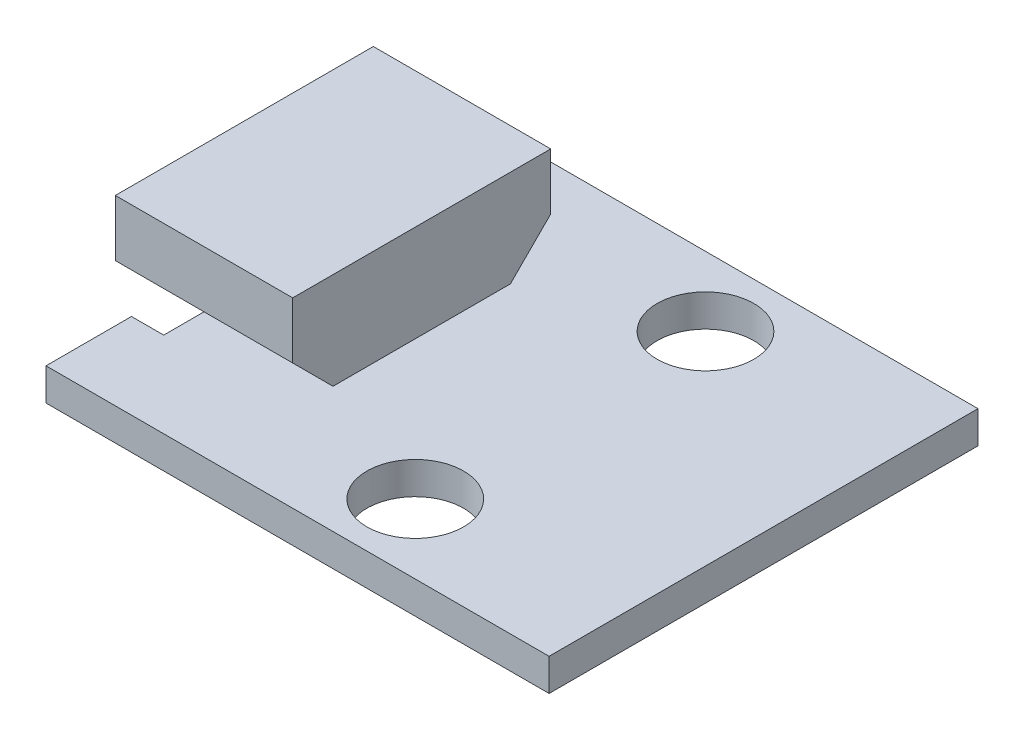
ISO-10303-21;
HEADER;
FILE_DESCRIPTION(('STEP AP214'),'2;1');
FILE_NAME('part.step','',(''),(''),'','','');
FILE_SCHEMA(('AUTOMOTIVE_DESIGN { 1 0 10303 214 1 1 1 1 }'));
ENDSEC;
DATA;
#1=APPLICATION_CONTEXT('core data for automotive mechanical design processes');
#2=APPLICATION_PROTOCOL_DEFINITION('international standard','automotive_design',2000,#1);
#3=PRODUCT_CONTEXT('',#1,'mechanical');
#4=PRODUCT('Part','Part','',(#3));
#5=PRODUCT_RELATED_PRODUCT_CATEGORY('part','',(#4));
#6=PRODUCT_DEFINITION_FORMATION('','',#4);
#7=PRODUCT_DEFINITION_CONTEXT('part definition',#1,'design');
#8=PRODUCT_DEFINITION('design','',#6,#7);
#9=PRODUCT_DEFINITION_SHAPE('','',#8);
#10=(LENGTH_UNIT() NAMED_UNIT(*) SI_UNIT(.MILLI.,.METRE.));
#11=(NAMED_UNIT(*) PLANE_ANGLE_UNIT() SI_UNIT($,.RADIAN.));
#12=(NAMED_UNIT(*) SI_UNIT($,.STERADIAN.) SOLID_ANGLE_UNIT());
#13=UNCERTAINTY_MEASURE_WITH_UNIT(LENGTH_MEASURE(1.E-05),#10,'distance_accuracy_value','');
#14=(GEOMETRIC_REPRESENTATION_CONTEXT(3) GLOBAL_UNCERTAINTY_ASSIGNED_CONTEXT((#13)) GLOBAL_UNIT_ASSIGNED_CONTEXT((#10,
#11,#12)) REPRESENTATION_CONTEXT('',''));
#15=CARTESIAN_POINT('',(0.,0.,0.));
#16=DIRECTION('',(0.,0.,1.));
#17=DIRECTION('',(1.,0.,0.));
#18=AXIS2_PLACEMENT_3D('',#15,#16,#17);
#19=CARTESIAN_POINT('',(-10.6,2.25,-10.65));
#20=DIRECTION('',(0.,0.,-1.));
#21=DIRECTION('',(-1.,0.,0.));
#22=AXIS2_PLACEMENT_3D('',#19,#20,#21);
#23=PLANE('',#22);
#24=DIRECTION('',(0.,-1.,0.));
#25=VECTOR('',#24,1.);
#26=CARTESIAN_POINT('',(-16.1,2.25,-10.65));
#27=LINE('',#26,#25);
#28=CARTESIAN_POINT('',(-16.1,4.,-10.65));
#29=VERTEX_POINT('',#28);
#30=CARTESIAN_POINT('',(-16.1,2.25,-10.65));
#31=VERTEX_POINT('',#30);
#32=EDGE_CURVE('E144',#29,#31,#27,.T.);
#33=ORIENTED_EDGE('',*,*,#32,.F.);
#34=DIRECTION('',(-1.,0.,0.));
#35=VECTOR('',#34,1.);
#36=CARTESIAN_POINT('',(-10.6,4.,-10.65));
#37=LINE('',#36,#35);
#38=CARTESIAN_POINT('',(-10.6,4.,-10.65));
#39=VERTEX_POINT('',#38);
#40=EDGE_CURVE('E12',#39,#29,#37,.T.);
#41=ORIENTED_EDGE('',*,*,#40,.F.);
#42=DIRECTION('',(0.,-1.,0.));
#43=VECTOR('',#42,1.);
#44=CARTESIAN_POINT('',(-10.6,2.25,-10.65));
#45=LINE('',#44,#43);
#46=CARTESIAN_POINT('',(-10.6,2.25,-10.65));
#47=VERTEX_POINT('',#46);
#48=EDGE_CURVE('E159',#39,#47,#45,.T.);
#49=ORIENTED_EDGE('',*,*,#48,.T.);
#50=DIRECTION('',(-1.,0.,0.));
#51=VECTOR('',#50,1.);
#52=CARTESIAN_POINT('',(-10.6,2.25,-10.65));
#53=LINE('',#52,#51);
#54=EDGE_CURVE('E49',#47,#31,#53,.T.);
#55=ORIENTED_EDGE('',*,*,#54,.T.);
#56=EDGE_LOOP('',(#33,#41,#49,#55));
#57=FACE_BOUND('',#56,.T.);
#58=ADVANCED_FACE('F46',(#57),#23,.T.);
#59=CARTESIAN_POINT('',(-10.6,4.,-2.65));
#60=DIRECTION('',(0.,1.,0.));
#61=DIRECTION('',(0.,0.,1.));
#62=AXIS2_PLACEMENT_3D('',#59,#60,#61);
#63=PLANE('',#62);
#64=DIRECTION('',(0.,0.,-1.));
#65=VECTOR('',#64,1.);
#66=CARTESIAN_POINT('',(-16.1,4.,-2.65));
#67=LINE('',#66,#65);
#68=CARTESIAN_POINT('',(-16.1,4.,-2.65));
#69=VERTEX_POINT('',#68);
#70=EDGE_CURVE('E157',#69,#29,#67,.T.);
#71=ORIENTED_EDGE('',*,*,#70,.F.);
#72=DIRECTION('',(-1.,0.,0.));
#73=VECTOR('',#72,1.);
#74=CARTESIAN_POINT('',(-10.6,4.,-2.65));
#75=LINE('',#74,#73);
#76=CARTESIAN_POINT('',(-10.6,4.,-2.65));
#77=VERTEX_POINT('',#76);
#78=EDGE_CURVE('E54',#77,#69,#75,.T.);
#79=ORIENTED_EDGE('',*,*,#78,.F.);
#80=DIRECTION('',(0.,0.,-1.));
#81=VECTOR('',#80,1.);
#82=CARTESIAN_POINT('',(-10.6,4.,-2.65));
#83=LINE('',#82,#81);
#84=EDGE_CURVE('E134',#77,#39,#83,.T.);
#85=ORIENTED_EDGE('',*,*,#84,.T.);
#86=ORIENTED_EDGE('',*,*,#40,.T.);
#87=EDGE_LOOP('',(#71,#79,#85,#86));
#88=FACE_BOUND('',#87,.T.);
#89=ADVANCED_FACE('F167',(#88),#63,.T.);
#90=CARTESIAN_POINT('',(-10.6,4.,-2.65));
#91=DIRECTION('',(0.,0.,1.));
#92=DIRECTION('',(1.,0.,0.));
#93=AXIS2_PLACEMENT_3D('',#90,#91,#92);
#94=PLANE('',#93);
#95=DIRECTION('',(0.,1.,0.));
#96=VECTOR('',#95,1.);
#97=CARTESIAN_POINT('',(-16.1,4.,-2.65));
#98=LINE('',#97,#96);
#99=CARTESIAN_POINT('',(-16.1,2.25,-2.65));
#100=VERTEX_POINT('',#99);
#101=EDGE_CURVE('E121',#100,#69,#98,.T.);
#102=ORIENTED_EDGE('',*,*,#101,.F.);
#103=DIRECTION('',(-1.,0.,0.));
#104=VECTOR('',#103,1.);
#105=CARTESIAN_POINT('',(-10.6,2.25,-2.65));
#106=LINE('',#105,#104);
#107=CARTESIAN_POINT('',(-10.6,2.25,-2.65));
#108=VERTEX_POINT('',#107);
#109=EDGE_CURVE('E115',#108,#100,#106,.T.);
#110=ORIENTED_EDGE('',*,*,#109,.F.);
#111=DIRECTION('',(0.,1.,0.));
#112=VECTOR('',#111,1.);
#113=CARTESIAN_POINT('',(-10.6,4.,-2.65));
#114=LINE('',#113,#112);
#115=EDGE_CURVE('E118',#108,#77,#114,.T.);
#116=ORIENTED_EDGE('',*,*,#115,.T.);
#117=ORIENTED_EDGE('',*,*,#78,.T.);
#118=EDGE_LOOP('',(#102,#110,#116,#117));
#119=FACE_BOUND('',#118,.T.);
#120=ADVANCED_FACE('F117',(#119),#94,.T.);
#121=CARTESIAN_POINT('',(-10.6,2.25,-2.65));
#122=DIRECTION('',(0.,-0.707106781186548,0.707106781186547));
#123=DIRECTION('',(0.,-0.707106781186547,-0.707106781186548));
#124=AXIS2_PLACEMENT_3D('',#121,#122,#123);
#125=PLANE('',#124);
#126=DIRECTION('',(0.,0.707106781186547,0.707106781186548));
#127=VECTOR('',#126,1.);
#128=CARTESIAN_POINT('',(-16.1,2.25,-2.65));
#129=LINE('',#128,#127);
#130=CARTESIAN_POINT('',(-16.1,1.,-3.9));
#131=VERTEX_POINT('',#130);
#132=EDGE_CURVE('E154',#131,#100,#129,.T.);
#133=ORIENTED_EDGE('',*,*,#132,.F.);
#134=DIRECTION('',(-1.,0.,0.));
#135=VECTOR('',#134,1.);
#136=CARTESIAN_POINT('',(-10.6,1.,-3.9));
#137=LINE('',#136,#135);
#138=CARTESIAN_POINT('',(-10.6,1.,-3.9));
#139=VERTEX_POINT('',#138);
#140=EDGE_CURVE('E126',#139,#131,#137,.T.);
#141=ORIENTED_EDGE('',*,*,#140,.F.);
#142=DIRECTION('',(0.,0.707106781186547,0.707106781186548));
#143=VECTOR('',#142,1.);
#144=CARTESIAN_POINT('',(-10.6,2.25,-2.65));
#145=LINE('',#144,#143);
#146=EDGE_CURVE('E132',#139,#108,#145,.T.);
#147=ORIENTED_EDGE('',*,*,#146,.T.);
#148=ORIENTED_EDGE('',*,*,#109,.T.);
#149=EDGE_LOOP('',(#133,#141,#147,#148));
#150=FACE_BOUND('',#149,.T.);
#151=ADVANCED_FACE('F136',(#150),#125,.T.);
#152=CARTESIAN_POINT('',(-10.6,1.,-9.4));
#153=DIRECTION('',(0.,-1.,0.));
#154=DIRECTION('',(0.,0.,-1.));
#155=AXIS2_PLACEMENT_3D('',#152,#153,#154);
#156=PLANE('',#155);
#157=DIRECTION('',(0.,0.,1.));
#158=VECTOR('',#157,1.);
#159=CARTESIAN_POINT('',(-16.1,1.,-9.4));
#160=LINE('',#159,#158);
#161=CARTESIAN_POINT('',(-16.1,1.,-9.4));
#162=VERTEX_POINT('',#161);
#163=EDGE_CURVE('E151',#162,#131,#160,.T.);
#164=ORIENTED_EDGE('',*,*,#163,.F.);
#165=DIRECTION('',(-1.,0.,0.));
#166=VECTOR('',#165,1.);
#167=CARTESIAN_POINT('',(-10.6,1.,-9.4));
#168=LINE('',#167,#166);
#169=CARTESIAN_POINT('',(-10.6,1.,-9.4));
#170=VERTEX_POINT('',#169);
#171=EDGE_CURVE('E162',#170,#162,#168,.T.);
#172=ORIENTED_EDGE('',*,*,#171,.F.);
#173=DIRECTION('',(0.,0.,1.));
#174=VECTOR('',#173,1.);
#175=CARTESIAN_POINT('',(-10.6,1.,-9.4));
#176=LINE('',#175,#174);
#177=EDGE_CURVE('E137',#170,#139,#176,.T.);
#178=ORIENTED_EDGE('',*,*,#177,.T.);
#179=ORIENTED_EDGE('',*,*,#140,.T.);
#180=EDGE_LOOP('',(#164,#172,#178,#179));
#181=FACE_BOUND('',#180,.T.);
#182=ADVANCED_FACE('F180',(#181),#156,.T.);
#183=CARTESIAN_POINT('',(-10.6,1.,-9.4));
#184=DIRECTION('',(0.,-0.707106781186548,-0.707106781186547));
#185=DIRECTION('',(0.,0.707106781186547,-0.707106781186548));
#186=AXIS2_PLACEMENT_3D('',#183,#184,#185);
#187=PLANE('',#186);
#188=DIRECTION('',(0.,-0.707106781186547,0.707106781186548));
#189=VECTOR('',#188,1.);
#190=CARTESIAN_POINT('',(-16.1,1.,-9.4));
#191=LINE('',#190,#189);
#192=EDGE_CURVE('E147',#31,#162,#191,.T.);
#193=ORIENTED_EDGE('',*,*,#192,.F.);
#194=ORIENTED_EDGE('',*,*,#54,.F.);
#195=DIRECTION('',(0.,-0.707106781186547,0.707106781186548));
#196=VECTOR('',#195,1.);
#197=CARTESIAN_POINT('',(-10.6,1.,-9.4));
#198=LINE('',#197,#196);
#199=EDGE_CURVE('E139',#47,#170,#198,.T.);
#200=ORIENTED_EDGE('',*,*,#199,.T.);
#201=ORIENTED_EDGE('',*,*,#171,.T.);
#202=EDGE_LOOP('',(#193,#194,#200,#201));
#203=FACE_BOUND('',#202,.T.);
#204=ADVANCED_FACE('F164',(#203),#187,.T.);
#205=CARTESIAN_POINT('',(-10.6,0.,0.));
#206=DIRECTION('',(-1.,0.,0.));
#207=DIRECTION('',(0.,0.,1.));
#208=AXIS2_PLACEMENT_3D('',#205,#206,#207);
#209=PLANE('',#208);
#210=ORIENTED_EDGE('',*,*,#48,.F.);
#211=ORIENTED_EDGE('',*,*,#84,.F.);
#212=ORIENTED_EDGE('',*,*,#115,.F.);
#213=ORIENTED_EDGE('',*,*,#146,.F.);
#214=ORIENTED_EDGE('',*,*,#177,.F.);
#215=ORIENTED_EDGE('',*,*,#199,.F.);
#216=EDGE_LOOP('',(#210,#211,#212,#213,#214,#215));
#217=FACE_BOUND('',#216,.T.);
#218=ADVANCED_FACE('F130',(#217),#209,.F.);
#219=CARTESIAN_POINT('',(-16.1,0.,0.));
#220=DIRECTION('',(-1.,0.,0.));
#221=DIRECTION('',(0.,0.,1.));
#222=AXIS2_PLACEMENT_3D('',#219,#220,#221);
#223=PLANE('',#222);
#224=DIRECTION('',(0.,0.,-1.));
#225=VECTOR('',#224,1.);
#226=CARTESIAN_POINT('',(-16.1,3.5,-3.15));
#227=LINE('',#226,#225);
#228=CARTESIAN_POINT('',(-16.1,3.5,-3.15));
#229=VERTEX_POINT('',#228);
#230=CARTESIAN_POINT('',(-16.1,3.5,-10.15));
#231=VERTEX_POINT('',#230);
#232=EDGE_CURVE('E62',#229,#231,#227,.T.);
#233=ORIENTED_EDGE('',*,*,#232,.F.);
#234=DIRECTION('',(0.,1.,0.));
#235=VECTOR('',#234,1.);
#236=CARTESIAN_POINT('',(-16.1,2.45710678118655,-3.15));
#237=LINE('',#236,#235);
#238=CARTESIAN_POINT('',(-16.1,2.45710678118655,-3.15));
#239=VERTEX_POINT('',#238);
#240=EDGE_CURVE('E234',#239,#229,#237,.T.);
#241=ORIENTED_EDGE('',*,*,#240,.F.);
#242=DIRECTION('',(0.,0.707106781186547,0.707106781186548));
#243=VECTOR('',#242,1.);
#244=CARTESIAN_POINT('',(-16.1,1.5,-4.10710678118654));
#245=LINE('',#244,#243);
#246=CARTESIAN_POINT('',(-16.1,1.5,-4.10710678118654));
#247=VERTEX_POINT('',#246);
#248=EDGE_CURVE('E239',#247,#239,#245,.T.);
#249=ORIENTED_EDGE('',*,*,#248,.F.);
#250=DIRECTION('',(0.,0.,1.));
#251=VECTOR('',#250,1.);
#252=CARTESIAN_POINT('',(-16.1,1.5,-9.19289321881345));
#253=LINE('',#252,#251);
#254=CARTESIAN_POINT('',(-16.1,1.5,-9.19289321881345));
#255=VERTEX_POINT('',#254);
#256=EDGE_CURVE('E257',#255,#247,#253,.T.);
#257=ORIENTED_EDGE('',*,*,#256,.F.);
#258=DIRECTION('',(0.,-0.707106781186547,0.707106781186548));
#259=VECTOR('',#258,1.);
#260=CARTESIAN_POINT('',(-16.1,2.45710678118655,-10.15));
#261=LINE('',#260,#259);
#262=CARTESIAN_POINT('',(-16.1,2.45710678118655,-10.15));
#263=VERTEX_POINT('',#262);
#264=EDGE_CURVE('E254',#263,#255,#261,.T.);
#265=ORIENTED_EDGE('',*,*,#264,.F.);
#266=DIRECTION('',(0.,-1.,0.));
#267=VECTOR('',#266,1.);
#268=CARTESIAN_POINT('',(-16.1,3.5,-10.15));
#269=LINE('',#268,#267);
#270=EDGE_CURVE('E251',#231,#263,#269,.T.);
#271=ORIENTED_EDGE('',*,*,#270,.F.);
#272=EDGE_LOOP('',(#233,#241,#249,#257,#265,#271));
#273=FACE_BOUND('',#272,.T.);
#274=ORIENTED_EDGE('',*,*,#32,.T.);
#275=ORIENTED_EDGE('',*,*,#192,.T.);
#276=ORIENTED_EDGE('',*,*,#163,.T.);
#277=ORIENTED_EDGE('',*,*,#132,.T.);
#278=ORIENTED_EDGE('',*,*,#101,.T.);
#279=ORIENTED_EDGE('',*,*,#70,.T.);
#280=EDGE_LOOP('',(#274,#275,#276,#277,#278,#279));
#281=FACE_BOUND('',#280,.T.);
#282=ADVANCED_FACE('F166',(#273,#281),#223,.T.);
#283=CARTESIAN_POINT('',(-11.1,3.5,-3.15));
#284=DIRECTION('',(0.,1.,0.));
#285=DIRECTION('',(0.,0.,1.));
#286=AXIS2_PLACEMENT_3D('',#283,#284,#285);
#287=PLANE('',#286);
#288=ORIENTED_EDGE('',*,*,#232,.T.);
#289=DIRECTION('',(-1.,0.,0.));
#290=VECTOR('',#289,1.);
#291=CARTESIAN_POINT('',(-11.1,3.5,-10.15));
#292=LINE('',#291,#290);
#293=CARTESIAN_POINT('',(-11.1,3.5,-10.15));
#294=VERTEX_POINT('',#293);
#295=EDGE_CURVE('E249',#294,#231,#292,.T.);
#296=ORIENTED_EDGE('',*,*,#295,.F.);
#297=DIRECTION('',(0.,0.,-1.));
#298=VECTOR('',#297,1.);
#299=CARTESIAN_POINT('',(-11.1,3.5,-3.15));
#300=LINE('',#299,#298);
#301=CARTESIAN_POINT('',(-11.1,3.5,-3.15));
#302=VERTEX_POINT('',#301);
#303=EDGE_CURVE('E225',#302,#294,#300,.T.);
#304=ORIENTED_EDGE('',*,*,#303,.F.);
#305=DIRECTION('',(-1.,0.,0.));
#306=VECTOR('',#305,1.);
#307=CARTESIAN_POINT('',(-11.1,3.5,-3.15));
#308=LINE('',#307,#306);
#309=EDGE_CURVE('E148',#302,#229,#308,.T.);
#310=ORIENTED_EDGE('',*,*,#309,.T.);
#311=EDGE_LOOP('',(#288,#296,#304,#310));
#312=FACE_BOUND('',#311,.T.);
#313=ADVANCED_FACE('F190',(#312),#287,.F.);
#314=CARTESIAN_POINT('',(-11.1,2.45710678118655,-3.15));
#315=DIRECTION('',(0.,0.,1.));
#316=DIRECTION('',(1.,0.,0.));
#317=AXIS2_PLACEMENT_3D('',#314,#315,#316);
#318=PLANE('',#317);
#319=ORIENTED_EDGE('',*,*,#240,.T.);
#320=ORIENTED_EDGE('',*,*,#309,.F.);
#321=DIRECTION('',(0.,1.,0.));
#322=VECTOR('',#321,1.);
#323=CARTESIAN_POINT('',(-11.1,2.45710678118655,-3.15));
#324=LINE('',#323,#322);
#325=CARTESIAN_POINT('',(-11.1,2.45710678118655,-3.15));
#326=VERTEX_POINT('',#325);
#327=EDGE_CURVE('E232',#326,#302,#324,.T.);
#328=ORIENTED_EDGE('',*,*,#327,.F.);
#329=DIRECTION('',(-1.,0.,0.));
#330=VECTOR('',#329,1.);
#331=CARTESIAN_POINT('',(-11.1,2.45710678118655,-3.15));
#332=LINE('',#331,#330);
#333=EDGE_CURVE('E263',#326,#239,#332,.T.);
#334=ORIENTED_EDGE('',*,*,#333,.T.);
#335=EDGE_LOOP('',(#319,#320,#328,#334));
#336=FACE_BOUND('',#335,.T.);
#337=ADVANCED_FACE('F195',(#336),#318,.F.);
#338=CARTESIAN_POINT('',(-11.1,1.5,-4.10710678118654));
#339=DIRECTION('',(0.,-0.707106781186548,0.707106781186547));
#340=DIRECTION('',(0.,-0.707106781186547,-0.707106781186548));
#341=AXIS2_PLACEMENT_3D('',#338,#339,#340);
#342=PLANE('',#341);
#343=ORIENTED_EDGE('',*,*,#248,.T.);
#344=ORIENTED_EDGE('',*,*,#333,.F.);
#345=DIRECTION('',(0.,0.707106781186547,0.707106781186548));
#346=VECTOR('',#345,1.);
#347=CARTESIAN_POINT('',(-11.1,1.5,-4.10710678118654));
#348=LINE('',#347,#346);
#349=CARTESIAN_POINT('',(-11.1,1.5,-4.10710678118654));
#350=VERTEX_POINT('',#349);
#351=EDGE_CURVE('E246',#350,#326,#348,.T.);
#352=ORIENTED_EDGE('',*,*,#351,.F.);
#353=DIRECTION('',(-1.,0.,0.));
#354=VECTOR('',#353,1.);
#355=CARTESIAN_POINT('',(-11.1,1.5,-4.10710678118654));
#356=LINE('',#355,#354);
#357=EDGE_CURVE('E266',#350,#247,#356,.T.);
#358=ORIENTED_EDGE('',*,*,#357,.T.);
#359=EDGE_LOOP('',(#343,#344,#352,#358));
#360=FACE_BOUND('',#359,.T.);
#361=ADVANCED_FACE('F208',(#360),#342,.F.);
#362=CARTESIAN_POINT('',(-11.1,1.5,-9.19289321881345));
#363=DIRECTION('',(0.,-1.,0.));
#364=DIRECTION('',(0.,0.,-1.));
#365=AXIS2_PLACEMENT_3D('',#362,#363,#364);
#366=PLANE('',#365);
#367=ORIENTED_EDGE('',*,*,#256,.T.);
#368=ORIENTED_EDGE('',*,*,#357,.F.);
#369=DIRECTION('',(0.,0.,1.));
#370=VECTOR('',#369,1.);
#371=CARTESIAN_POINT('',(-11.1,1.5,-9.19289321881345));
#372=LINE('',#371,#370);
#373=CARTESIAN_POINT('',(-11.1,1.5,-9.19289321881345));
#374=VERTEX_POINT('',#373);
#375=EDGE_CURVE('E243',#374,#350,#372,.T.);
#376=ORIENTED_EDGE('',*,*,#375,.F.);
#377=DIRECTION('',(-1.,0.,0.));
#378=VECTOR('',#377,1.);
#379=CARTESIAN_POINT('',(-11.1,1.5,-9.19289321881345));
#380=LINE('',#379,#378);
#381=EDGE_CURVE('E269',#374,#255,#380,.T.);
#382=ORIENTED_EDGE('',*,*,#381,.T.);
#383=EDGE_LOOP('',(#367,#368,#376,#382));
#384=FACE_BOUND('',#383,.T.);
#385=ADVANCED_FACE('F204',(#384),#366,.F.);
#386=CARTESIAN_POINT('',(-11.1,2.45710678118655,-10.15));
#387=DIRECTION('',(0.,-0.707106781186548,-0.707106781186547));
#388=DIRECTION('',(0.,0.707106781186547,-0.707106781186548));
#389=AXIS2_PLACEMENT_3D('',#386,#387,#388);
#390=PLANE('',#389);
#391=ORIENTED_EDGE('',*,*,#264,.T.);
#392=ORIENTED_EDGE('',*,*,#381,.F.);
#393=DIRECTION('',(0.,-0.707106781186547,0.707106781186548));
#394=VECTOR('',#393,1.);
#395=CARTESIAN_POINT('',(-11.1,2.45710678118655,-10.15));
#396=LINE('',#395,#394);
#397=CARTESIAN_POINT('',(-11.1,2.45710678118655,-10.15));
#398=VERTEX_POINT('',#397);
#399=EDGE_CURVE('E236',#398,#374,#396,.T.);
#400=ORIENTED_EDGE('',*,*,#399,.F.);
#401=DIRECTION('',(-1.,0.,0.));
#402=VECTOR('',#401,1.);
#403=CARTESIAN_POINT('',(-11.1,2.45710678118655,-10.15));
#404=LINE('',#403,#402);
#405=EDGE_CURVE('E272',#398,#263,#404,.T.);
#406=ORIENTED_EDGE('',*,*,#405,.T.);
#407=EDGE_LOOP('',(#391,#392,#400,#406));
#408=FACE_BOUND('',#407,.T.);
#409=ADVANCED_FACE('F200',(#408),#390,.F.);
#410=CARTESIAN_POINT('',(-11.1,3.5,-10.15));
#411=DIRECTION('',(0.,0.,-1.));
#412=DIRECTION('',(-1.,0.,0.));
#413=AXIS2_PLACEMENT_3D('',#410,#411,#412);
#414=PLANE('',#413);
#415=ORIENTED_EDGE('',*,*,#270,.T.);
#416=ORIENTED_EDGE('',*,*,#405,.F.);
#417=DIRECTION('',(0.,-1.,0.));
#418=VECTOR('',#417,1.);
#419=CARTESIAN_POINT('',(-11.1,3.5,-10.15));
#420=LINE('',#419,#418);
#421=EDGE_CURVE('E229',#294,#398,#420,.T.);
#422=ORIENTED_EDGE('',*,*,#421,.F.);
#423=ORIENTED_EDGE('',*,*,#295,.T.);
#424=EDGE_LOOP('',(#415,#416,#422,#423));
#425=FACE_BOUND('',#424,.T.);
#426=ADVANCED_FACE('F196',(#425),#414,.F.);
#427=CARTESIAN_POINT('',(-11.1,0.,0.));
#428=DIRECTION('',(-1.,0.,0.));
#429=DIRECTION('',(0.,0.,1.));
#430=AXIS2_PLACEMENT_3D('',#427,#428,#429);
#431=PLANE('',#430);
#432=ORIENTED_EDGE('',*,*,#303,.T.);
#433=ORIENTED_EDGE('',*,*,#421,.T.);
#434=ORIENTED_EDGE('',*,*,#399,.T.);
#435=ORIENTED_EDGE('',*,*,#375,.T.);
#436=ORIENTED_EDGE('',*,*,#351,.T.);
#437=ORIENTED_EDGE('',*,*,#327,.T.);
#438=EDGE_LOOP('',(#432,#433,#434,#435,#436,#437));
#439=FACE_BOUND('',#438,.T.);
#440=ADVANCED_FACE('F199',(#439),#431,.T.);
#441=CLOSED_SHELL('',(#58,#89,#120,#151,#182,#204,#218,#282,#313,#337,#361,#385,#409,#426,#440));
#442=MANIFOLD_SOLID_BREP('B2',#441);
#443=CARTESIAN_POINT('',(0.,1.,-10.65));
#444=DIRECTION('',(0.,0.,-1.));
#445=DIRECTION('',(-1.,0.,0.));
#446=AXIS2_PLACEMENT_3D('',#443,#444,#445);
#447=PLANE('',#446);
#448=DIRECTION('',(1.,0.,0.));
#449=VECTOR('',#448,1.);
#450=CARTESIAN_POINT('',(0.,0.,-10.65));
#451=LINE('',#450,#449);
#452=CARTESIAN_POINT('',(-15.6,0.,-10.65));
#453=VERTEX_POINT('',#452);
#454=CARTESIAN_POINT('',(-14.6,0.,-10.65));
#455=VERTEX_POINT('',#454);
#456=EDGE_CURVE('E493',#453,#455,#451,.T.);
#457=ORIENTED_EDGE('',*,*,#456,.T.);
#458=DIRECTION('',(0.,-1.,0.));
#459=VECTOR('',#458,1.);
#460=CARTESIAN_POINT('',(-14.6,1.,-10.65));
#461=LINE('',#460,#459);
#462=CARTESIAN_POINT('',(-14.6,1.,-10.65));
#463=VERTEX_POINT('',#462);
#464=EDGE_CURVE('E44',#463,#455,#461,.T.);
#465=ORIENTED_EDGE('',*,*,#464,.F.);
#466=DIRECTION('',(1.,0.,0.));
#467=VECTOR('',#466,1.);
#468=CARTESIAN_POINT('',(0.,1.,-10.65));
#469=LINE('',#468,#467);
#470=CARTESIAN_POINT('',(-15.6,1.,-10.65));
#471=VERTEX_POINT('',#470);
#472=EDGE_CURVE('E533',#471,#463,#469,.T.);
#473=ORIENTED_EDGE('',*,*,#472,.F.);
#474=DIRECTION('',(0.,-1.,0.));
#475=VECTOR('',#474,1.);
#476=CARTESIAN_POINT('',(-15.6,1.,-10.65));
#477=LINE('',#476,#475);
#478=EDGE_CURVE('E405',#471,#453,#477,.T.);
#479=ORIENTED_EDGE('',*,*,#478,.T.);
#480=EDGE_LOOP('',(#457,#465,#473,#479));
#481=FACE_BOUND('',#480,.T.);
#482=ADVANCED_FACE('F388',(#481),#447,.F.);
#483=CARTESIAN_POINT('',(-14.6,1.,0.));
#484=DIRECTION('',(1.,0.,0.));
#485=DIRECTION('',(0.,0.,-1.));
#486=AXIS2_PLACEMENT_3D('',#483,#484,#485);
#487=PLANE('',#486);
#488=DIRECTION('',(0.,0.,1.));
#489=VECTOR('',#488,1.);
#490=CARTESIAN_POINT('',(-14.6,0.,0.));
#491=LINE('',#490,#489);
#492=CARTESIAN_POINT('',(-14.6,0.,-2.65));
#493=VERTEX_POINT('',#492);
#494=EDGE_CURVE('E495',#455,#493,#491,.T.);
#495=ORIENTED_EDGE('',*,*,#494,.T.);
#496=DIRECTION('',(0.,-1.,0.));
#497=VECTOR('',#496,1.);
#498=CARTESIAN_POINT('',(-14.6,1.,-2.65));
#499=LINE('',#498,#497);
#500=CARTESIAN_POINT('',(-14.6,1.,-2.65));
#501=VERTEX_POINT('',#500);
#502=EDGE_CURVE('E397',#501,#493,#499,.T.);
#503=ORIENTED_EDGE('',*,*,#502,.F.);
#504=DIRECTION('',(0.,0.,1.));
#505=VECTOR('',#504,1.);
#506=CARTESIAN_POINT('',(-14.6,1.,0.));
#507=LINE('',#506,#505);
#508=EDGE_CURVE('E444',#463,#501,#507,.T.);
#509=ORIENTED_EDGE('',*,*,#508,.F.);
#510=ORIENTED_EDGE('',*,*,#464,.T.);
#511=EDGE_LOOP('',(#495,#503,#509,#510));
#512=FACE_BOUND('',#511,.T.);
#513=ADVANCED_FACE('F523',(#512),#487,.F.);
#514=CARTESIAN_POINT('',(0.,1.,-2.64999999999999));
#515=DIRECTION('',(0.,0.,-1.));
#516=DIRECTION('',(-1.,0.,0.));
#517=AXIS2_PLACEMENT_3D('',#514,#515,#516);
#518=PLANE('',#517);
#519=DIRECTION('',(1.,0.,0.));
#520=VECTOR('',#519,1.);
#521=CARTESIAN_POINT('',(0.,0.,-2.64999999999999));
#522=LINE('',#521,#520);
#523=CARTESIAN_POINT('',(-15.6,0.,-2.65));
#524=VERTEX_POINT('',#523);
#525=EDGE_CURVE('E498',#524,#493,#522,.T.);
#526=ORIENTED_EDGE('',*,*,#525,.F.);
#527=DIRECTION('',(0.,-1.,0.));
#528=VECTOR('',#527,1.);
#529=CARTESIAN_POINT('',(-15.6,1.,-2.65));
#530=LINE('',#529,#528);
#531=CARTESIAN_POINT('',(-15.6,1.,-2.65));
#532=VERTEX_POINT('',#531);
#533=EDGE_CURVE('E516',#532,#524,#530,.T.);
#534=ORIENTED_EDGE('',*,*,#533,.F.);
#535=DIRECTION('',(1.,0.,0.));
#536=VECTOR('',#535,1.);
#537=CARTESIAN_POINT('',(0.,1.,-2.64999999999999));
#538=LINE('',#537,#536);
#539=EDGE_CURVE('E522',#532,#501,#538,.T.);
#540=ORIENTED_EDGE('',*,*,#539,.T.);
#541=ORIENTED_EDGE('',*,*,#502,.T.);
#542=EDGE_LOOP('',(#526,#534,#540,#541));
#543=FACE_BOUND('',#542,.T.);
#544=ADVANCED_FACE('F520',(#543),#518,.T.);
#545=CARTESIAN_POINT('',(-15.6,1.,0.));
#546=DIRECTION('',(-1.,0.,0.));
#547=DIRECTION('',(0.,0.,1.));
#548=AXIS2_PLACEMENT_3D('',#545,#546,#547);
#549=PLANE('',#548);
#550=DIRECTION('',(0.,0.,-1.));
#551=VECTOR('',#550,1.);
#552=CARTESIAN_POINT('',(-15.6,0.,0.));
#553=LINE('',#552,#551);
#554=CARTESIAN_POINT('',(-15.6,0.,0.));
#555=VERTEX_POINT('',#554);
#556=EDGE_CURVE('E501',#555,#524,#553,.T.);
#557=ORIENTED_EDGE('',*,*,#556,.F.);
#558=DIRECTION('',(0.,-1.,0.));
#559=VECTOR('',#558,1.);
#560=CARTESIAN_POINT('',(-15.6,1.,0.));
#561=LINE('',#560,#559);
#562=CARTESIAN_POINT('',(-15.6,1.,0.));
#563=VERTEX_POINT('',#562);
#564=EDGE_CURVE('E514',#563,#555,#561,.T.);
#565=ORIENTED_EDGE('',*,*,#564,.F.);
#566=DIRECTION('',(0.,0.,-1.));
#567=VECTOR('',#566,1.);
#568=CARTESIAN_POINT('',(-15.6,1.,0.));
#569=LINE('',#568,#567);
#570=EDGE_CURVE('E484',#563,#532,#569,.T.);
#571=ORIENTED_EDGE('',*,*,#570,.T.);
#572=ORIENTED_EDGE('',*,*,#533,.T.);
#573=EDGE_LOOP('',(#557,#565,#571,#572));
#574=FACE_BOUND('',#573,.T.);
#575=ADVANCED_FACE('F530',(#574),#549,.T.);
#576=CARTESIAN_POINT('',(0.,1.,0.));
#577=DIRECTION('',(0.,0.,1.));
#578=DIRECTION('',(1.,0.,0.));
#579=AXIS2_PLACEMENT_3D('',#576,#577,#578);
#580=PLANE('',#579);
#581=DIRECTION('',(-1.,0.,0.));
#582=VECTOR('',#581,1.);
#583=CARTESIAN_POINT('',(0.,0.,0.));
#584=LINE('',#583,#582);
#585=CARTESIAN_POINT('',(0.,0.,0.));
#586=VERTEX_POINT('',#585);
#587=EDGE_CURVE('E504',#586,#555,#584,.T.);
#588=ORIENTED_EDGE('',*,*,#587,.F.);
#589=DIRECTION('',(0.,-1.,0.));
#590=VECTOR('',#589,1.);
#591=CARTESIAN_POINT('',(0.,1.,0.));
#592=LINE('',#591,#590);
#593=CARTESIAN_POINT('',(0.,1.,0.));
#594=VERTEX_POINT('',#593);
#595=EDGE_CURVE('E478',#594,#586,#592,.T.);
#596=ORIENTED_EDGE('',*,*,#595,.F.);
#597=DIRECTION('',(-1.,0.,0.));
#598=VECTOR('',#597,1.);
#599=CARTESIAN_POINT('',(0.,1.,0.));
#600=LINE('',#599,#598);
#601=EDGE_CURVE('E468',#594,#563,#600,.T.);
#602=ORIENTED_EDGE('',*,*,#601,.T.);
#603=ORIENTED_EDGE('',*,*,#564,.T.);
#604=EDGE_LOOP('',(#588,#596,#602,#603));
#605=FACE_BOUND('',#604,.T.);
#606=ADVANCED_FACE('F537',(#605),#580,.T.);
#607=CARTESIAN_POINT('',(0.,1.,0.));
#608=DIRECTION('',(-1.,0.,0.));
#609=DIRECTION('',(0.,0.,1.));
#610=AXIS2_PLACEMENT_3D('',#607,#608,#609);
#611=PLANE('',#610);
#612=DIRECTION('',(0.,0.,-1.));
#613=VECTOR('',#612,1.);
#614=CARTESIAN_POINT('',(0.,0.,0.));
#615=LINE('',#614,#613);
#616=CARTESIAN_POINT('',(0.,0.,-13.3));
#617=VERTEX_POINT('',#616);
#618=EDGE_CURVE('E475',#586,#617,#615,.T.);
#619=ORIENTED_EDGE('',*,*,#618,.T.);
#620=DIRECTION('',(0.,-1.,0.));
#621=VECTOR('',#620,1.);
#622=CARTESIAN_POINT('',(0.,1.,-13.3));
#623=LINE('',#622,#621);
#624=CARTESIAN_POINT('',(0.,1.,-13.3));
#625=VERTEX_POINT('',#624);
#626=EDGE_CURVE('E472',#625,#617,#623,.T.);
#627=ORIENTED_EDGE('',*,*,#626,.F.);
#628=DIRECTION('',(0.,0.,-1.));
#629=VECTOR('',#628,1.);
#630=CARTESIAN_POINT('',(0.,1.,0.));
#631=LINE('',#630,#629);
#632=EDGE_CURVE('E460',#594,#625,#631,.T.);
#633=ORIENTED_EDGE('',*,*,#632,.F.);
#634=ORIENTED_EDGE('',*,*,#595,.T.);
#635=EDGE_LOOP('',(#619,#627,#633,#634));
#636=FACE_BOUND('',#635,.T.);
#637=ADVANCED_FACE('F473',(#636),#611,.F.);
#638=CARTESIAN_POINT('',(0.,1.,-13.3));
#639=DIRECTION('',(0.,0.,1.));
#640=DIRECTION('',(1.,0.,0.));
#641=AXIS2_PLACEMENT_3D('',#638,#639,#640);
#642=PLANE('',#641);
#643=DIRECTION('',(-1.,0.,0.));
#644=VECTOR('',#643,1.);
#645=CARTESIAN_POINT('',(0.,0.,-13.3));
#646=LINE('',#645,#644);
#647=CARTESIAN_POINT('',(-15.6,0.,-13.3));
#648=VERTEX_POINT('',#647);
#649=EDGE_CURVE('E509',#617,#648,#646,.T.);
#650=ORIENTED_EDGE('',*,*,#649,.T.);
#651=DIRECTION('',(0.,-1.,0.));
#652=VECTOR('',#651,1.);
#653=CARTESIAN_POINT('',(-15.6,1.,-13.3));
#654=LINE('',#653,#652);
#655=CARTESIAN_POINT('',(-15.6,1.,-13.3));
#656=VERTEX_POINT('',#655);
#657=EDGE_CURVE('E432',#656,#648,#654,.T.);
#658=ORIENTED_EDGE('',*,*,#657,.F.);
#659=DIRECTION('',(-1.,0.,0.));
#660=VECTOR('',#659,1.);
#661=CARTESIAN_POINT('',(0.,1.,-13.3));
#662=LINE('',#661,#660);
#663=EDGE_CURVE('E465',#625,#656,#662,.T.);
#664=ORIENTED_EDGE('',*,*,#663,.F.);
#665=ORIENTED_EDGE('',*,*,#626,.T.);
#666=EDGE_LOOP('',(#650,#658,#664,#665));
#667=FACE_BOUND('',#666,.T.);
#668=ADVANCED_FACE('F480',(#667),#642,.F.);
#669=CARTESIAN_POINT('',(-6.3,1.,-11.15));
#670=DIRECTION('',(0.,-1.,0.));
#671=DIRECTION('',(0.,0.,-1.));
#672=AXIS2_PLACEMENT_3D('',#669,#670,#671);
#673=CYLINDRICAL_SURFACE('',#672,1.5);
#674=CARTESIAN_POINT('',(-6.3,1.,-11.15));
#675=DIRECTION('',(0.,1.,0.));
#676=DIRECTION('',(0.,0.,1.));
#677=AXIS2_PLACEMENT_3D('',#674,#675,#676);
#678=CIRCLE('',#677,1.5);
#679=CARTESIAN_POINT('',(-6.3,1.,-9.65));
#680=VERTEX_POINT('',#679);
#681=EDGE_CURVE('E541',#680,#680,#678,.T.);
#682=ORIENTED_EDGE('',*,*,#681,.T.);
#683=EDGE_LOOP('',(#682));
#684=FACE_BOUND('',#683,.T.);
#685=CARTESIAN_POINT('',(-6.3,0.,-11.15));
#686=DIRECTION('',(0.,1.,0.));
#687=DIRECTION('',(0.,0.,1.));
#688=AXIS2_PLACEMENT_3D('',#685,#686,#687);
#689=CIRCLE('',#688,1.5);
#690=CARTESIAN_POINT('',(-6.3,0.,-9.65));
#691=VERTEX_POINT('',#690);
#692=EDGE_CURVE('E490',#691,#691,#689,.T.);
#693=ORIENTED_EDGE('',*,*,#692,.F.);
#694=EDGE_LOOP('',(#693));
#695=FACE_BOUND('',#694,.T.);
#696=ADVANCED_FACE('F554',(#684,#695),#673,.F.);
#697=CARTESIAN_POINT('',(-6.3,1.,-2.15));
#698=DIRECTION('',(0.,-1.,0.));
#699=DIRECTION('',(0.,0.,-1.));
#700=AXIS2_PLACEMENT_3D('',#697,#698,#699);
#701=CYLINDRICAL_SURFACE('',#700,1.5);
#702=CARTESIAN_POINT('',(-6.3,1.,-2.15));
#703=DIRECTION('',(0.,1.,0.));
#704=DIRECTION('',(0.,0.,1.));
#705=AXIS2_PLACEMENT_3D('',#702,#703,#704);
#706=CIRCLE('',#705,1.5);
#707=CARTESIAN_POINT('',(-6.3,1.,-0.650000000000001));
#708=VERTEX_POINT('',#707);
#709=EDGE_CURVE('E539',#708,#708,#706,.T.);
#710=ORIENTED_EDGE('',*,*,#709,.T.);
#711=EDGE_LOOP('',(#710));
#712=FACE_BOUND('',#711,.T.);
#713=CARTESIAN_POINT('',(-6.3,0.,-2.15));
#714=DIRECTION('',(0.,1.,0.));
#715=DIRECTION('',(0.,0.,1.));
#716=AXIS2_PLACEMENT_3D('',#713,#714,#715);
#717=CIRCLE('',#716,1.5);
#718=CARTESIAN_POINT('',(-6.3,0.,-0.650000000000001));
#719=VERTEX_POINT('',#718);
#720=EDGE_CURVE('E487',#719,#719,#717,.T.);
#721=ORIENTED_EDGE('',*,*,#720,.F.);
#722=EDGE_LOOP('',(#721));
#723=FACE_BOUND('',#722,.T.);
#724=ADVANCED_FACE('F390',(#712,#723),#701,.F.);
#725=EDGE_CURVE('E505',#453,#648,#553,.T.);
#726=ORIENTED_EDGE('',*,*,#725,.F.);
#727=ORIENTED_EDGE('',*,*,#478,.F.);
#728=EDGE_CURVE('E481',#471,#656,#569,.T.);
#729=ORIENTED_EDGE('',*,*,#728,.T.);
#730=ORIENTED_EDGE('',*,*,#657,.T.);
#731=EDGE_LOOP('',(#726,#727,#729,#730));
#732=FACE_BOUND('',#731,.T.);
#733=ADVANCED_FACE('F561',(#732),#549,.T.);
#734=CARTESIAN_POINT('',(0.,1.,0.));
#735=DIRECTION('',(0.,1.,0.));
#736=DIRECTION('',(0.,0.,1.));
#737=AXIS2_PLACEMENT_3D('',#734,#735,#736);
#738=PLANE('',#737);
#739=ORIENTED_EDGE('',*,*,#709,.F.);
#740=EDGE_LOOP('',(#739));
#741=FACE_BOUND('',#740,.T.);
#742=ORIENTED_EDGE('',*,*,#681,.F.);
#743=EDGE_LOOP('',(#742));
#744=FACE_BOUND('',#743,.T.);
#745=ORIENTED_EDGE('',*,*,#472,.T.);
#746=ORIENTED_EDGE('',*,*,#508,.T.);
#747=ORIENTED_EDGE('',*,*,#539,.F.);
#748=ORIENTED_EDGE('',*,*,#570,.F.);
#749=ORIENTED_EDGE('',*,*,#601,.F.);
#750=ORIENTED_EDGE('',*,*,#632,.T.);
#751=ORIENTED_EDGE('',*,*,#663,.T.);
#752=ORIENTED_EDGE('',*,*,#728,.F.);
#753=EDGE_LOOP('',(#745,#746,#747,#748,#749,#750,#751,#752));
#754=FACE_BOUND('',#753,.T.);
#755=ADVANCED_FACE('F462',(#741,#744,#754),#738,.T.);
#756=CARTESIAN_POINT('',(0.,0.,0.));
#757=DIRECTION('',(0.,1.,0.));
#758=DIRECTION('',(0.,0.,1.));
#759=AXIS2_PLACEMENT_3D('',#756,#757,#758);
#760=PLANE('',#759);
#761=ORIENTED_EDGE('',*,*,#720,.T.);
#762=EDGE_LOOP('',(#761));
#763=FACE_BOUND('',#762,.T.);
#764=ORIENTED_EDGE('',*,*,#692,.T.);
#765=EDGE_LOOP('',(#764));
#766=FACE_BOUND('',#765,.T.);
#767=ORIENTED_EDGE('',*,*,#456,.F.);
#768=ORIENTED_EDGE('',*,*,#725,.T.);
#769=ORIENTED_EDGE('',*,*,#649,.F.);
#770=ORIENTED_EDGE('',*,*,#618,.F.);
#771=ORIENTED_EDGE('',*,*,#587,.T.);
#772=ORIENTED_EDGE('',*,*,#556,.T.);
#773=ORIENTED_EDGE('',*,*,#525,.T.);
#774=ORIENTED_EDGE('',*,*,#494,.F.);
#775=EDGE_LOOP('',(#767,#768,#769,#770,#771,#772,#773,#774));
#776=FACE_BOUND('',#775,.T.);
#777=ADVANCED_FACE('F526',(#763,#766,#776),#760,.F.);
#778=CLOSED_SHELL('',(#482,#513,#544,#575,#606,#637,#668,#696,#724,#733,#755,#777));
#779=MANIFOLD_SOLID_BREP('B6',#778);
#780=ADVANCED_BREP_SHAPE_REPRESENTATION('',(#18,#442,#779),#14);
#781=SHAPE_DEFINITION_REPRESENTATION(#9,#780);
ENDSEC;
END-ISO-10303-21;
